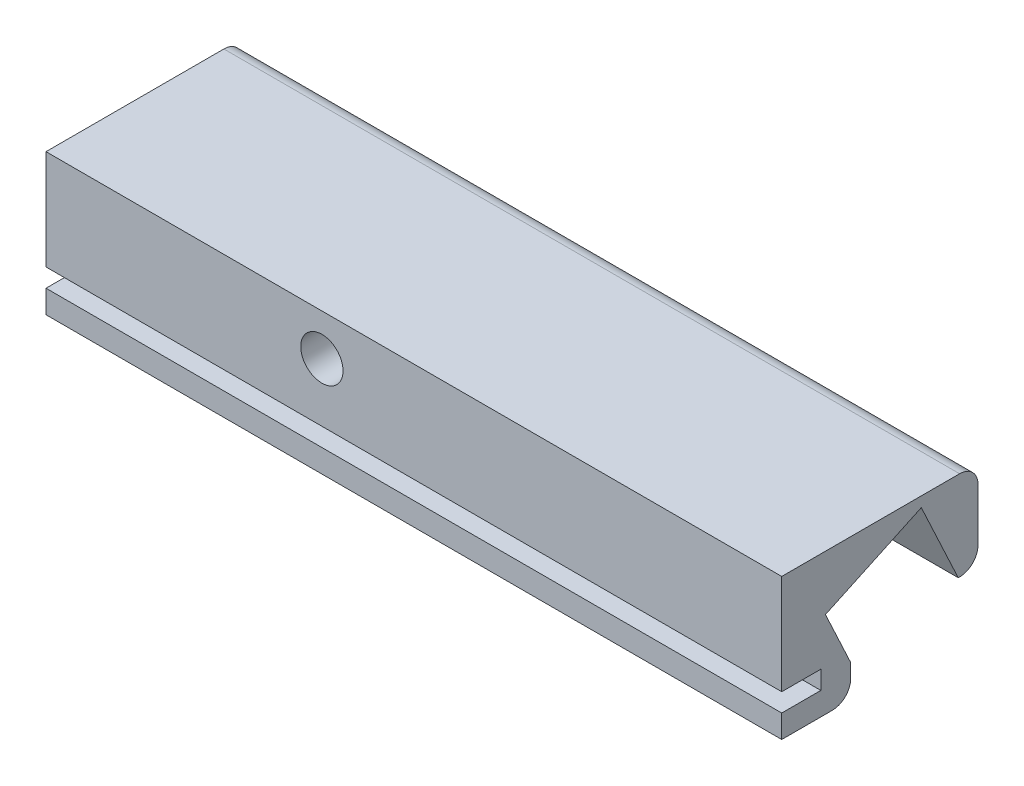
ISO-10303-21;
HEADER;
FILE_DESCRIPTION(('STEP AP214'),'2;1');
FILE_NAME('part.step','',(''),(''),'','','');
FILE_SCHEMA(('AUTOMOTIVE_DESIGN { 1 0 10303 214 1 1 1 1 }'));
ENDSEC;
DATA;
#1=APPLICATION_CONTEXT('core data for automotive mechanical design processes');
#2=APPLICATION_PROTOCOL_DEFINITION('international standard','automotive_design',2000,#1);
#3=PRODUCT_CONTEXT('',#1,'mechanical');
#4=PRODUCT('Part','Part','',(#3));
#5=PRODUCT_RELATED_PRODUCT_CATEGORY('part','',(#4));
#6=PRODUCT_DEFINITION_FORMATION('','',#4);
#7=PRODUCT_DEFINITION_CONTEXT('part definition',#1,'design');
#8=PRODUCT_DEFINITION('design','',#6,#7);
#9=PRODUCT_DEFINITION_SHAPE('','',#8);
#10=(LENGTH_UNIT() NAMED_UNIT(*) SI_UNIT(.MILLI.,.METRE.));
#11=(NAMED_UNIT(*) PLANE_ANGLE_UNIT() SI_UNIT($,.RADIAN.));
#12=(NAMED_UNIT(*) SI_UNIT($,.STERADIAN.) SOLID_ANGLE_UNIT());
#13=UNCERTAINTY_MEASURE_WITH_UNIT(LENGTH_MEASURE(1.E-05),#10,'distance_accuracy_value','');
#14=(GEOMETRIC_REPRESENTATION_CONTEXT(3) GLOBAL_UNCERTAINTY_ASSIGNED_CONTEXT((#13)) GLOBAL_UNIT_ASSIGNED_CONTEXT((#10,
#11,#12)) REPRESENTATION_CONTEXT('',''));
#15=CARTESIAN_POINT('',(0.,0.,0.));
#16=DIRECTION('',(0.,0.,1.));
#17=DIRECTION('',(1.,0.,0.));
#18=AXIS2_PLACEMENT_3D('',#15,#16,#17);
#19=CARTESIAN_POINT('',(80.,15.360110010018,0.));
#20=DIRECTION('',(0.,0.,-1.));
#21=DIRECTION('',(0.,1.,0.));
#22=AXIS2_PLACEMENT_3D('',#19,#20,#21);
#23=PLANE('',#22);
#24=CARTESIAN_POINT('',(30.,10.860110010018,0.));
#25=DIRECTION('',(0.,0.,1.));
#26=DIRECTION('',(1.,0.,0.));
#27=AXIS2_PLACEMENT_3D('',#24,#25,#26);
#28=CIRCLE('',#27,2.3);
#29=CARTESIAN_POINT('',(32.3,10.860110010018,0.));
#30=VERTEX_POINT('',#29);
#31=EDGE_CURVE('E189',#30,#30,#28,.T.);
#32=ORIENTED_EDGE('',*,*,#31,.F.);
#33=EDGE_LOOP('',(#32));
#34=FACE_BOUND('',#33,.T.);
#35=DIRECTION('',(0.,-1.,0.));
#36=VECTOR('',#35,1.);
#37=CARTESIAN_POINT('',(0.,15.360110010018,0.));
#38=LINE('',#37,#36);
#39=CARTESIAN_POINT('',(0.,15.360110010018,0.));
#40=VERTEX_POINT('',#39);
#41=CARTESIAN_POINT('',(0.,4.5,0.));
#42=VERTEX_POINT('',#41);
#43=EDGE_CURVE('E238',#40,#42,#38,.T.);
#44=ORIENTED_EDGE('',*,*,#43,.T.);
#45=DIRECTION('',(-1.,0.,0.));
#46=VECTOR('',#45,1.);
#47=CARTESIAN_POINT('',(0.,4.5,0.));
#48=LINE('',#47,#46);
#49=CARTESIAN_POINT('',(80.,4.5,0.));
#50=VERTEX_POINT('',#49);
#51=EDGE_CURVE('E173',#50,#42,#48,.T.);
#52=ORIENTED_EDGE('',*,*,#51,.F.);
#53=DIRECTION('',(0.,-1.,0.));
#54=VECTOR('',#53,1.);
#55=CARTESIAN_POINT('',(80.,15.360110010018,0.));
#56=LINE('',#55,#54);
#57=CARTESIAN_POINT('',(80.,15.360110010018,0.));
#58=VERTEX_POINT('',#57);
#59=EDGE_CURVE('E217',#58,#50,#56,.T.);
#60=ORIENTED_EDGE('',*,*,#59,.F.);
#61=DIRECTION('',(-1.,0.,0.));
#62=VECTOR('',#61,1.);
#63=CARTESIAN_POINT('',(80.,15.360110010018,0.));
#64=LINE('',#63,#62);
#65=EDGE_CURVE('E237',#58,#40,#64,.T.);
#66=ORIENTED_EDGE('',*,*,#65,.T.);
#67=EDGE_LOOP('',(#44,#52,#60,#66));
#68=FACE_BOUND('',#67,.T.);
#69=ADVANCED_FACE('F41',(#34,#68),#23,.F.);
#70=CARTESIAN_POINT('',(80.,2.5,0.));
#71=VERTEX_POINT('',#70);
#72=CARTESIAN_POINT('',(80.,0.,0.));
#73=VERTEX_POINT('',#72);
#74=EDGE_CURVE('E221',#71,#73,#56,.T.);
#75=ORIENTED_EDGE('',*,*,#74,.F.);
#76=DIRECTION('',(1.,0.,0.));
#77=VECTOR('',#76,1.);
#78=CARTESIAN_POINT('',(0.,2.5,0.));
#79=LINE('',#78,#77);
#80=CARTESIAN_POINT('',(0.,2.5,0.));
#81=VERTEX_POINT('',#80);
#82=EDGE_CURVE('E309',#81,#71,#79,.T.);
#83=ORIENTED_EDGE('',*,*,#82,.F.);
#84=CARTESIAN_POINT('',(0.,0.,0.));
#85=VERTEX_POINT('',#84);
#86=EDGE_CURVE('E178',#81,#85,#38,.T.);
#87=ORIENTED_EDGE('',*,*,#86,.T.);
#88=DIRECTION('',(-1.,0.,0.));
#89=VECTOR('',#88,1.);
#90=CARTESIAN_POINT('',(80.,0.,0.));
#91=LINE('',#90,#89);
#92=EDGE_CURVE('E11',#73,#85,#91,.T.);
#93=ORIENTED_EDGE('',*,*,#92,.F.);
#94=EDGE_LOOP('',(#75,#83,#87,#93));
#95=FACE_BOUND('',#94,.T.);
#96=ADVANCED_FACE('F43',(#95),#23,.F.);
#97=CARTESIAN_POINT('',(80.,0.,0.));
#98=DIRECTION('',(0.,1.,0.));
#99=DIRECTION('',(0.,0.,1.));
#100=AXIS2_PLACEMENT_3D('',#97,#98,#99);
#101=PLANE('',#100);
#102=DIRECTION('',(0.,0.,-1.));
#103=VECTOR('',#102,1.);
#104=CARTESIAN_POINT('',(0.,0.,0.));
#105=LINE('',#104,#103);
#106=CARTESIAN_POINT('',(0.,0.,-5.4994615533352));
#107=VERTEX_POINT('',#106);
#108=EDGE_CURVE('E241',#85,#107,#105,.T.);
#109=ORIENTED_EDGE('',*,*,#108,.T.);
#110=DIRECTION('',(-1.,0.,0.));
#111=VECTOR('',#110,1.);
#112=CARTESIAN_POINT('',(80.,0.,-5.4994615533352));
#113=LINE('',#112,#111);
#114=CARTESIAN_POINT('',(80.,0.,-5.4994615533352));
#115=VERTEX_POINT('',#114);
#116=EDGE_CURVE('E49',#115,#107,#113,.T.);
#117=ORIENTED_EDGE('',*,*,#116,.F.);
#118=DIRECTION('',(0.,0.,-1.));
#119=VECTOR('',#118,1.);
#120=CARTESIAN_POINT('',(80.,0.,0.));
#121=LINE('',#120,#119);
#122=EDGE_CURVE('E220',#73,#115,#121,.T.);
#123=ORIENTED_EDGE('',*,*,#122,.F.);
#124=ORIENTED_EDGE('',*,*,#92,.T.);
#125=EDGE_LOOP('',(#109,#117,#123,#124));
#126=FACE_BOUND('',#125,.T.);
#127=ADVANCED_FACE('F307',(#126),#101,.F.);
#128=CARTESIAN_POINT('',(80.,2.0005384466648,-5.4994615533352));
#129=DIRECTION('',(-1.,0.,0.));
#130=DIRECTION('',(0.,0.,1.));
#131=AXIS2_PLACEMENT_3D('',#128,#129,#130);
#132=CYLINDRICAL_SURFACE('',#131,2.0005384466648);
#133=CARTESIAN_POINT('',(0.,2.0005384466648,-5.4994615533352));
#134=DIRECTION('',(1.,0.,0.));
#135=DIRECTION('',(0.,0.,-1.));
#136=AXIS2_PLACEMENT_3D('',#133,#134,#135);
#137=CIRCLE('',#136,2.0005384466648);
#138=CARTESIAN_POINT('',(0.,2.0005384466648,-7.5));
#139=VERTEX_POINT('',#138);
#140=EDGE_CURVE('E243',#107,#139,#137,.T.);
#141=ORIENTED_EDGE('',*,*,#140,.T.);
#142=DIRECTION('',(-1.,0.,0.));
#143=VECTOR('',#142,1.);
#144=CARTESIAN_POINT('',(80.,2.0005384466648,-7.5));
#145=LINE('',#144,#143);
#146=CARTESIAN_POINT('',(80.,2.0005384466648,-7.5));
#147=VERTEX_POINT('',#146);
#148=EDGE_CURVE('E281',#147,#139,#145,.T.);
#149=ORIENTED_EDGE('',*,*,#148,.F.);
#150=CARTESIAN_POINT('',(80.,2.0005384466648,-5.4994615533352));
#151=DIRECTION('',(1.,0.,0.));
#152=DIRECTION('',(0.,0.,-1.));
#153=AXIS2_PLACEMENT_3D('',#150,#151,#152);
#154=CIRCLE('',#153,2.0005384466648);
#155=EDGE_CURVE('E223',#115,#147,#154,.T.);
#156=ORIENTED_EDGE('',*,*,#155,.F.);
#157=ORIENTED_EDGE('',*,*,#116,.T.);
#158=EDGE_LOOP('',(#141,#149,#156,#157));
#159=FACE_BOUND('',#158,.T.);
#160=ADVANCED_FACE('F288',(#159),#132,.T.);
#161=CARTESIAN_POINT('',(80.,3.5,-7.5));
#162=DIRECTION('',(0.,0.,1.));
#163=DIRECTION('',(0.,-1.,0.));
#164=AXIS2_PLACEMENT_3D('',#161,#162,#163);
#165=PLANE('',#164);
#166=DIRECTION('',(0.,1.,0.));
#167=VECTOR('',#166,1.);
#168=CARTESIAN_POINT('',(0.,3.5,-7.5));
#169=LINE('',#168,#167);
#170=CARTESIAN_POINT('',(0.,3.5,-7.5));
#171=VERTEX_POINT('',#170);
#172=EDGE_CURVE('E245',#139,#171,#169,.T.);
#173=ORIENTED_EDGE('',*,*,#172,.T.);
#174=DIRECTION('',(-1.,0.,0.));
#175=VECTOR('',#174,1.);
#176=CARTESIAN_POINT('',(80.,3.5,-7.5));
#177=LINE('',#176,#175);
#178=CARTESIAN_POINT('',(52.,3.5,-7.5));
#179=VERTEX_POINT('',#178);
#180=EDGE_CURVE('E277',#179,#171,#177,.T.);
#181=ORIENTED_EDGE('',*,*,#180,.F.);
#182=CARTESIAN_POINT('',(80.,3.5,-7.5));
#183=VERTEX_POINT('',#182);
#184=EDGE_CURVE('E278',#183,#179,#177,.T.);
#185=ORIENTED_EDGE('',*,*,#184,.F.);
#186=DIRECTION('',(0.,1.,0.));
#187=VECTOR('',#186,1.);
#188=CARTESIAN_POINT('',(80.,3.5,-7.5));
#189=LINE('',#188,#187);
#190=EDGE_CURVE('E225',#147,#183,#189,.T.);
#191=ORIENTED_EDGE('',*,*,#190,.F.);
#192=ORIENTED_EDGE('',*,*,#148,.T.);
#193=EDGE_LOOP('',(#173,#181,#185,#191,#192));
#194=FACE_BOUND('',#193,.T.);
#195=ADVANCED_FACE('F297',(#194),#165,.F.);
#196=CARTESIAN_POINT('',(80.,8.36011001001802,-17.9225395509215));
#197=DIRECTION('',(0.,0.906307787036651,0.422618261740697));
#198=DIRECTION('',(0.,-0.422618261740697,0.906307787036651));
#199=AXIS2_PLACEMENT_3D('',#196,#197,#198);
#200=PLANE('',#199);
#201=CARTESIAN_POINT('',(43.85,5.93005500500901,-12.7112697754607));
#202=DIRECTION('',(0.,-0.906307787036651,-0.422618261740697));
#203=DIRECTION('',(0.,0.422618261740697,-0.906307787036651));
#204=AXIS2_PLACEMENT_3D('',#201,#202,#203);
#205=CIRCLE('',#204,2.30000000000001);
#206=CARTESIAN_POINT('',(43.85,6.90207700701262,-14.7957776856451));
#207=VERTEX_POINT('',#206);
#208=EDGE_CURVE('E208',#207,#207,#205,.T.);
#209=ORIENTED_EDGE('',*,*,#208,.F.);
#210=EDGE_LOOP('',(#209));
#211=FACE_BOUND('',#210,.T.);
#212=DIRECTION('',(-1.,0.,0.));
#213=VECTOR('',#212,1.);
#214=CARTESIAN_POINT('',(80.,8.36011001001802,-17.9225395509215));
#215=LINE('',#214,#213);
#216=CARTESIAN_POINT('',(52.,8.36011001001802,-17.9225395509215));
#217=VERTEX_POINT('',#216);
#218=CARTESIAN_POINT('',(0.,8.36011001001802,-17.9225395509215));
#219=VERTEX_POINT('',#218);
#220=EDGE_CURVE('E275',#217,#219,#215,.T.);
#221=ORIENTED_EDGE('',*,*,#220,.F.);
#222=DIRECTION('',(0.,0.422618261740697,-0.906307787036651));
#223=VECTOR('',#222,1.);
#224=CARTESIAN_POINT('',(52.,3.5,-7.5));
#225=LINE('',#224,#223);
#226=EDGE_CURVE('E188',#179,#217,#225,.T.);
#227=ORIENTED_EDGE('',*,*,#226,.F.);
#228=ORIENTED_EDGE('',*,*,#180,.T.);
#229=DIRECTION('',(0.,0.422618261740697,-0.906307787036651));
#230=VECTOR('',#229,1.);
#231=CARTESIAN_POINT('',(0.,8.36011001001802,-17.9225395509215));
#232=LINE('',#231,#230);
#233=EDGE_CURVE('E248',#171,#219,#232,.T.);
#234=ORIENTED_EDGE('',*,*,#233,.T.);
#235=EDGE_LOOP('',(#221,#227,#228,#234));
#236=FACE_BOUND('',#235,.T.);
#237=ADVANCED_FACE('F344',(#211,#236),#200,.F.);
#238=CARTESIAN_POINT('',(80.,5.64118664890806,-19.1903943361436));
#239=DIRECTION('',(0.,0.422618261740697,-0.906307787036651));
#240=DIRECTION('',(0.,0.906307787036651,0.422618261740697));
#241=AXIS2_PLACEMENT_3D('',#238,#239,#240);
#242=PLANE('',#241);
#243=DIRECTION('',(0.,-0.906307787036651,-0.422618261740697));
#244=VECTOR('',#243,1.);
#245=CARTESIAN_POINT('',(0.,5.64118664890806,-19.1903943361436));
#246=LINE('',#245,#244);
#247=CARTESIAN_POINT('',(0.,5.64118664890806,-19.1903943361436));
#248=VERTEX_POINT('',#247);
#249=EDGE_CURVE('E251',#219,#248,#246,.T.);
#250=ORIENTED_EDGE('',*,*,#249,.T.);
#251=DIRECTION('',(-1.,0.,0.));
#252=VECTOR('',#251,1.);
#253=CARTESIAN_POINT('',(80.,5.64118664890806,-19.1903943361436));
#254=LINE('',#253,#252);
#255=CARTESIAN_POINT('',(80.,5.64118664890806,-19.1903943361436));
#256=VERTEX_POINT('',#255);
#257=EDGE_CURVE('E272',#256,#248,#254,.T.);
#258=ORIENTED_EDGE('',*,*,#257,.F.);
#259=DIRECTION('',(0.,-0.906307787036651,-0.422618261740697));
#260=VECTOR('',#259,1.);
#261=CARTESIAN_POINT('',(80.,5.64118664890806,-19.1903943361436));
#262=LINE('',#261,#260);
#263=CARTESIAN_POINT('',(80.,14.2511106257563,-15.175520849607));
#264=VERTEX_POINT('',#263);
#265=EDGE_CURVE('E64',#264,#256,#262,.T.);
#266=ORIENTED_EDGE('',*,*,#265,.F.);
#267=DIRECTION('',(1.,0.,0.));
#268=VECTOR('',#267,1.);
#269=CARTESIAN_POINT('',(52.,14.2511106257563,-15.175520849607));
#270=LINE('',#269,#268);
#271=CARTESIAN_POINT('',(52.,14.2511106257563,-15.175520849607));
#272=VERTEX_POINT('',#271);
#273=EDGE_CURVE('E196',#272,#264,#270,.T.);
#274=ORIENTED_EDGE('',*,*,#273,.F.);
#275=DIRECTION('',(0.,-0.906307787036651,-0.422618261740697));
#276=VECTOR('',#275,1.);
#277=CARTESIAN_POINT('',(52.,14.2511106257563,-15.175520849607));
#278=LINE('',#277,#276);
#279=EDGE_CURVE('E203',#272,#217,#278,.T.);
#280=ORIENTED_EDGE('',*,*,#279,.T.);
#281=ORIENTED_EDGE('',*,*,#220,.T.);
#282=EDGE_LOOP('',(#250,#258,#266,#274,#280,#281));
#283=FACE_BOUND('',#282,.T.);
#284=ADVANCED_FACE('F340',(#283),#242,.F.);
#285=CARTESIAN_POINT('',(80.,7.63552847711335,-19.3407295358501));
#286=DIRECTION('',(-1.,0.,0.));
#287=DIRECTION('',(0.,0.,1.));
#288=AXIS2_PLACEMENT_3D('',#285,#286,#287);
#289=CYLINDRICAL_SURFACE('',#288,2.);
#290=CARTESIAN_POINT('',(0.,7.63552847711335,-19.3407295358501));
#291=DIRECTION('',(1.,0.,0.));
#292=DIRECTION('',(0.,0.,-1.));
#293=AXIS2_PLACEMENT_3D('',#290,#291,#292);
#294=CIRCLE('',#293,2.);
#295=CARTESIAN_POINT('',(0.,7.63552847711335,-21.3407295358501));
#296=VERTEX_POINT('',#295);
#297=EDGE_CURVE('E253',#248,#296,#294,.T.);
#298=ORIENTED_EDGE('',*,*,#297,.T.);
#299=DIRECTION('',(-1.,0.,0.));
#300=VECTOR('',#299,1.);
#301=CARTESIAN_POINT('',(80.,7.63552847711335,-21.3407295358501));
#302=LINE('',#301,#300);
#303=CARTESIAN_POINT('',(80.,7.63552847711335,-21.3407295358501));
#304=VERTEX_POINT('',#303);
#305=EDGE_CURVE('E269',#304,#296,#302,.T.);
#306=ORIENTED_EDGE('',*,*,#305,.F.);
#307=CARTESIAN_POINT('',(80.,7.63552847711335,-19.3407295358501));
#308=DIRECTION('',(1.,0.,0.));
#309=DIRECTION('',(0.,0.,-1.));
#310=AXIS2_PLACEMENT_3D('',#307,#308,#309);
#311=CIRCLE('',#310,2.);
#312=EDGE_CURVE('E229',#256,#304,#311,.T.);
#313=ORIENTED_EDGE('',*,*,#312,.F.);
#314=ORIENTED_EDGE('',*,*,#257,.T.);
#315=EDGE_LOOP('',(#298,#306,#313,#314));
#316=FACE_BOUND('',#315,.T.);
#317=ADVANCED_FACE('F339',(#316),#289,.T.);
#318=CARTESIAN_POINT('',(80.,7.63552847711335,-21.3407295358501));
#319=DIRECTION('',(0.,0.,1.));
#320=DIRECTION('',(0.,-1.,0.));
#321=AXIS2_PLACEMENT_3D('',#318,#319,#320);
#322=PLANE('',#321);
#323=DIRECTION('',(0.,1.,0.));
#324=VECTOR('',#323,1.);
#325=CARTESIAN_POINT('',(0.,7.63552847711335,-21.3407295358501));
#326=LINE('',#325,#324);
#327=CARTESIAN_POINT('',(0.,13.360110010018,-21.3407295358501));
#328=VERTEX_POINT('',#327);
#329=EDGE_CURVE('E255',#296,#328,#326,.T.);
#330=ORIENTED_EDGE('',*,*,#329,.T.);
#331=DIRECTION('',(-1.,0.,0.));
#332=VECTOR('',#331,1.);
#333=CARTESIAN_POINT('',(80.,13.360110010018,-21.3407295358501));
#334=LINE('',#333,#332);
#335=CARTESIAN_POINT('',(80.,13.360110010018,-21.3407295358501));
#336=VERTEX_POINT('',#335);
#337=EDGE_CURVE('E266',#336,#328,#334,.T.);
#338=ORIENTED_EDGE('',*,*,#337,.F.);
#339=DIRECTION('',(0.,1.,0.));
#340=VECTOR('',#339,1.);
#341=CARTESIAN_POINT('',(80.,7.63552847711335,-21.3407295358501));
#342=LINE('',#341,#340);
#343=EDGE_CURVE('E231',#304,#336,#342,.T.);
#344=ORIENTED_EDGE('',*,*,#343,.F.);
#345=ORIENTED_EDGE('',*,*,#305,.T.);
#346=EDGE_LOOP('',(#330,#338,#344,#345));
#347=FACE_BOUND('',#346,.T.);
#348=ADVANCED_FACE('F335',(#347),#322,.F.);
#349=CARTESIAN_POINT('',(80.,13.360110010018,-19.3407295358501));
#350=DIRECTION('',(-1.,0.,0.));
#351=DIRECTION('',(0.,0.,1.));
#352=AXIS2_PLACEMENT_3D('',#349,#350,#351);
#353=CYLINDRICAL_SURFACE('',#352,2.);
#354=CARTESIAN_POINT('',(0.,13.360110010018,-19.3407295358501));
#355=DIRECTION('',(1.,0.,0.));
#356=DIRECTION('',(0.,0.,1.));
#357=AXIS2_PLACEMENT_3D('',#354,#355,#356);
#358=CIRCLE('',#357,2.);
#359=CARTESIAN_POINT('',(0.,15.360110010018,-19.3407295358501));
#360=VERTEX_POINT('',#359);
#361=EDGE_CURVE('E257',#328,#360,#358,.T.);
#362=ORIENTED_EDGE('',*,*,#361,.T.);
#363=DIRECTION('',(-1.,0.,0.));
#364=VECTOR('',#363,1.);
#365=CARTESIAN_POINT('',(80.,15.360110010018,-19.3407295358501));
#366=LINE('',#365,#364);
#367=CARTESIAN_POINT('',(80.,15.360110010018,-19.3407295358501));
#368=VERTEX_POINT('',#367);
#369=EDGE_CURVE('E263',#368,#360,#366,.T.);
#370=ORIENTED_EDGE('',*,*,#369,.F.);
#371=CARTESIAN_POINT('',(80.,13.360110010018,-19.3407295358501));
#372=DIRECTION('',(1.,0.,0.));
#373=DIRECTION('',(0.,0.,1.));
#374=AXIS2_PLACEMENT_3D('',#371,#372,#373);
#375=CIRCLE('',#374,2.);
#376=EDGE_CURVE('E233',#336,#368,#375,.T.);
#377=ORIENTED_EDGE('',*,*,#376,.F.);
#378=ORIENTED_EDGE('',*,*,#337,.T.);
#379=EDGE_LOOP('',(#362,#370,#377,#378));
#380=FACE_BOUND('',#379,.T.);
#381=ADVANCED_FACE('F331',(#380),#353,.T.);
#382=CARTESIAN_POINT('',(80.,15.360110010018,-19.3407295358501));
#383=DIRECTION('',(0.,-1.,0.));
#384=DIRECTION('',(0.,0.,-1.));
#385=AXIS2_PLACEMENT_3D('',#382,#383,#384);
#386=PLANE('',#385);
#387=DIRECTION('',(0.,0.,1.));
#388=VECTOR('',#387,1.);
#389=CARTESIAN_POINT('',(0.,15.360110010018,-19.3407295358501));
#390=LINE('',#389,#388);
#391=EDGE_CURVE('E259',#360,#40,#390,.T.);
#392=ORIENTED_EDGE('',*,*,#391,.T.);
#393=ORIENTED_EDGE('',*,*,#65,.F.);
#394=DIRECTION('',(0.,0.,1.));
#395=VECTOR('',#394,1.);
#396=CARTESIAN_POINT('',(80.,15.360110010018,-19.3407295358501));
#397=LINE('',#396,#395);
#398=EDGE_CURVE('E235',#368,#58,#397,.T.);
#399=ORIENTED_EDGE('',*,*,#398,.F.);
#400=ORIENTED_EDGE('',*,*,#369,.T.);
#401=EDGE_LOOP('',(#392,#393,#399,#400));
#402=FACE_BOUND('',#401,.T.);
#403=ADVANCED_FACE('F325',(#402),#386,.F.);
#404=CARTESIAN_POINT('',(80.,2.0005384466648,-5.4994615533352));
#405=DIRECTION('',(1.,0.,0.));
#406=DIRECTION('',(0.,0.,-1.));
#407=AXIS2_PLACEMENT_3D('',#404,#405,#406);
#408=PLANE('',#407);
#409=DIRECTION('',(0.,0.,1.));
#410=VECTOR('',#409,1.);
#411=CARTESIAN_POINT('',(80.,4.5,-4.25));
#412=LINE('',#411,#410);
#413=CARTESIAN_POINT('',(80.,4.5,-4.25));
#414=VERTEX_POINT('',#413);
#415=EDGE_CURVE('E180',#414,#50,#412,.T.);
#416=ORIENTED_EDGE('',*,*,#415,.F.);
#417=DIRECTION('',(0.,1.,0.));
#418=VECTOR('',#417,1.);
#419=CARTESIAN_POINT('',(80.,4.5,-4.25));
#420=LINE('',#419,#418);
#421=CARTESIAN_POINT('',(80.,2.5,-4.25));
#422=VERTEX_POINT('',#421);
#423=EDGE_CURVE('E166',#422,#414,#420,.T.);
#424=ORIENTED_EDGE('',*,*,#423,.F.);
#425=DIRECTION('',(0.,0.,1.));
#426=VECTOR('',#425,1.);
#427=CARTESIAN_POINT('',(80.,2.5,-4.25));
#428=LINE('',#427,#426);
#429=EDGE_CURVE('E164',#422,#71,#428,.T.);
#430=ORIENTED_EDGE('',*,*,#429,.T.);
#431=ORIENTED_EDGE('',*,*,#74,.T.);
#432=ORIENTED_EDGE('',*,*,#122,.T.);
#433=ORIENTED_EDGE('',*,*,#155,.T.);
#434=ORIENTED_EDGE('',*,*,#190,.T.);
#435=DIRECTION('',(0.,-0.906307787036651,-0.422618261740697));
#436=VECTOR('',#435,1.);
#437=CARTESIAN_POINT('',(80.,9.39100061573824,-4.75298129868547));
#438=LINE('',#437,#436);
#439=CARTESIAN_POINT('',(80.,9.39100061573824,-4.75298129868547));
#440=VERTEX_POINT('',#439);
#441=EDGE_CURVE('E209',#440,#183,#438,.T.);
#442=ORIENTED_EDGE('',*,*,#441,.F.);
#443=DIRECTION('',(0.,-0.422618261740697,0.906307787036651));
#444=VECTOR('',#443,1.);
#445=CARTESIAN_POINT('',(80.,9.39100061573824,-4.75298129868547));
#446=LINE('',#445,#444);
#447=EDGE_CURVE('E198',#264,#440,#446,.T.);
#448=ORIENTED_EDGE('',*,*,#447,.F.);
#449=ORIENTED_EDGE('',*,*,#265,.T.);
#450=ORIENTED_EDGE('',*,*,#312,.T.);
#451=ORIENTED_EDGE('',*,*,#343,.T.);
#452=ORIENTED_EDGE('',*,*,#376,.T.);
#453=ORIENTED_EDGE('',*,*,#398,.T.);
#454=ORIENTED_EDGE('',*,*,#59,.T.);
#455=EDGE_LOOP('',(#416,#424,#430,#431,#432,#433,#434,#442,#448,#449,#450,#451,#452,#453,#454));
#456=FACE_BOUND('',#455,.T.);
#457=ADVANCED_FACE('F303',(#456),#408,.T.);
#458=CARTESIAN_POINT('',(0.,2.0005384466648,-5.4994615533352));
#459=DIRECTION('',(1.,0.,0.));
#460=DIRECTION('',(0.,0.,-1.));
#461=AXIS2_PLACEMENT_3D('',#458,#459,#460);
#462=PLANE('',#461);
#463=DIRECTION('',(0.,-1.,0.));
#464=VECTOR('',#463,1.);
#465=CARTESIAN_POINT('',(0.,4.5,-4.25));
#466=LINE('',#465,#464);
#467=CARTESIAN_POINT('',(0.,4.5,-4.25));
#468=VERTEX_POINT('',#467);
#469=CARTESIAN_POINT('',(0.,2.5,-4.25));
#470=VERTEX_POINT('',#469);
#471=EDGE_CURVE('E167',#468,#470,#466,.T.);
#472=ORIENTED_EDGE('',*,*,#471,.F.);
#473=DIRECTION('',(0.,0.,1.));
#474=VECTOR('',#473,1.);
#475=CARTESIAN_POINT('',(0.,4.5,-4.25));
#476=LINE('',#475,#474);
#477=EDGE_CURVE('E192',#468,#42,#476,.T.);
#478=ORIENTED_EDGE('',*,*,#477,.T.);
#479=ORIENTED_EDGE('',*,*,#43,.F.);
#480=ORIENTED_EDGE('',*,*,#391,.F.);
#481=ORIENTED_EDGE('',*,*,#361,.F.);
#482=ORIENTED_EDGE('',*,*,#329,.F.);
#483=ORIENTED_EDGE('',*,*,#297,.F.);
#484=ORIENTED_EDGE('',*,*,#249,.F.);
#485=ORIENTED_EDGE('',*,*,#233,.F.);
#486=ORIENTED_EDGE('',*,*,#172,.F.);
#487=ORIENTED_EDGE('',*,*,#140,.F.);
#488=ORIENTED_EDGE('',*,*,#108,.F.);
#489=ORIENTED_EDGE('',*,*,#86,.F.);
#490=DIRECTION('',(0.,0.,1.));
#491=VECTOR('',#490,1.);
#492=CARTESIAN_POINT('',(0.,2.5,-4.25));
#493=LINE('',#492,#491);
#494=EDGE_CURVE('E161',#470,#81,#493,.T.);
#495=ORIENTED_EDGE('',*,*,#494,.F.);
#496=EDGE_LOOP('',(#472,#478,#479,#480,#481,#482,#483,#484,#485,#486,#487,#488,#489,#495));
#497=FACE_BOUND('',#496,.T.);
#498=ADVANCED_FACE('F176',(#497),#462,.F.);
#499=CARTESIAN_POINT('',(43.85,10.0084400466739,-10.8094875976276));
#500=DIRECTION('',(0.,-0.906307787036651,-0.422618261740697));
#501=DIRECTION('',(0.,0.422618261740697,-0.906307787036651));
#502=AXIS2_PLACEMENT_3D('',#499,#500,#501);
#503=CYLINDRICAL_SURFACE('',#502,2.30000000000001);
#504=CARTESIAN_POINT('',(43.85,10.0084400466739,-10.8094875976276));
#505=DIRECTION('',(0.,-0.906307787036651,-0.422618261740697));
#506=DIRECTION('',(0.,0.422618261740697,-0.906307787036651));
#507=AXIS2_PLACEMENT_3D('',#504,#505,#506);
#508=CIRCLE('',#507,2.30000000000001);
#509=CARTESIAN_POINT('',(43.85,10.9804620486776,-12.8939955078119));
#510=VERTEX_POINT('',#509);
#511=EDGE_CURVE('E212',#510,#510,#508,.T.);
#512=ORIENTED_EDGE('',*,*,#511,.F.);
#513=EDGE_LOOP('',(#512));
#514=FACE_BOUND('',#513,.T.);
#515=ORIENTED_EDGE('',*,*,#208,.T.);
#516=EDGE_LOOP('',(#515));
#517=FACE_BOUND('',#516,.T.);
#518=ADVANCED_FACE('F398',(#514,#517),#503,.F.);
#519=CARTESIAN_POINT('',(43.85,10.0084400466739,-10.8094875976276));
#520=DIRECTION('',(0.,-0.906307787036651,-0.422618261740697));
#521=DIRECTION('',(0.,0.422618261740697,-0.906307787036651));
#522=AXIS2_PLACEMENT_3D('',#519,#520,#521);
#523=PLANE('',#522);
#524=ORIENTED_EDGE('',*,*,#511,.T.);
#525=EDGE_LOOP('',(#524));
#526=FACE_BOUND('',#525,.T.);
#527=ADVANCED_FACE('F402',(#526),#523,.T.);
#528=CARTESIAN_POINT('',(52.,9.39100061573824,-4.75298129868547));
#529=DIRECTION('',(-1.,0.,0.));
#530=DIRECTION('',(0.,0.,1.));
#531=AXIS2_PLACEMENT_3D('',#528,#529,#530);
#532=PLANE('',#531);
#533=ORIENTED_EDGE('',*,*,#226,.T.);
#534=ORIENTED_EDGE('',*,*,#279,.F.);
#535=DIRECTION('',(0.,0.422618261740697,-0.906307787036651));
#536=VECTOR('',#535,1.);
#537=CARTESIAN_POINT('',(52.,9.39100061573824,-4.75298129868547));
#538=LINE('',#537,#536);
#539=CARTESIAN_POINT('',(52.,9.39100061573824,-4.75298129868547));
#540=VERTEX_POINT('',#539);
#541=EDGE_CURVE('E193',#540,#272,#538,.T.);
#542=ORIENTED_EDGE('',*,*,#541,.F.);
#543=DIRECTION('',(0.,-0.906307787036651,-0.422618261740697));
#544=VECTOR('',#543,1.);
#545=CARTESIAN_POINT('',(52.,9.39100061573824,-4.75298129868547));
#546=LINE('',#545,#544);
#547=EDGE_CURVE('E206',#540,#179,#546,.T.);
#548=ORIENTED_EDGE('',*,*,#547,.T.);
#549=EDGE_LOOP('',(#533,#534,#542,#548));
#550=FACE_BOUND('',#549,.T.);
#551=ADVANCED_FACE('F346',(#550),#532,.F.);
#552=CARTESIAN_POINT('',(52.,9.39100061573824,-4.75298129868547));
#553=DIRECTION('',(0.,-0.422618261740697,0.906307787036651));
#554=DIRECTION('',(0.,-0.906307787036651,-0.422618261740697));
#555=AXIS2_PLACEMENT_3D('',#552,#553,#554);
#556=PLANE('',#555);
#557=ORIENTED_EDGE('',*,*,#184,.T.);
#558=ORIENTED_EDGE('',*,*,#547,.F.);
#559=DIRECTION('',(-1.,0.,0.));
#560=VECTOR('',#559,1.);
#561=CARTESIAN_POINT('',(52.,9.39100061573824,-4.75298129868547));
#562=LINE('',#561,#560);
#563=EDGE_CURVE('E200',#440,#540,#562,.T.);
#564=ORIENTED_EDGE('',*,*,#563,.F.);
#565=ORIENTED_EDGE('',*,*,#441,.T.);
#566=EDGE_LOOP('',(#557,#558,#564,#565));
#567=FACE_BOUND('',#566,.T.);
#568=ADVANCED_FACE('F350',(#567),#556,.F.);
#569=CARTESIAN_POINT('',(0.,5.89321227099353,2.74805001309728));
#570=DIRECTION('',(0.,-0.906307787036651,-0.422618261740697));
#571=DIRECTION('',(0.,0.422618261740697,-0.906307787036651));
#572=AXIS2_PLACEMENT_3D('',#569,#570,#571);
#573=PLANE('',#572);
#574=ORIENTED_EDGE('',*,*,#541,.T.);
#575=ORIENTED_EDGE('',*,*,#273,.T.);
#576=ORIENTED_EDGE('',*,*,#447,.T.);
#577=ORIENTED_EDGE('',*,*,#563,.T.);
#578=EDGE_LOOP('',(#574,#575,#576,#577));
#579=FACE_BOUND('',#578,.T.);
#580=ADVANCED_FACE('F352',(#579),#573,.T.);
#581=CARTESIAN_POINT('',(30.,10.860110010018,-4.5));
#582=DIRECTION('',(0.,0.,1.));
#583=DIRECTION('',(1.,0.,0.));
#584=AXIS2_PLACEMENT_3D('',#581,#582,#583);
#585=CYLINDRICAL_SURFACE('',#584,2.3);
#586=CARTESIAN_POINT('',(30.,10.860110010018,-4.5));
#587=DIRECTION('',(0.,0.,1.));
#588=DIRECTION('',(1.,0.,0.));
#589=AXIS2_PLACEMENT_3D('',#586,#587,#588);
#590=CIRCLE('',#589,2.3);
#591=CARTESIAN_POINT('',(32.3,10.860110010018,-4.5));
#592=VERTEX_POINT('',#591);
#593=EDGE_CURVE('E185',#592,#592,#590,.T.);
#594=ORIENTED_EDGE('',*,*,#593,.F.);
#595=EDGE_LOOP('',(#594));
#596=FACE_BOUND('',#595,.T.);
#597=ORIENTED_EDGE('',*,*,#31,.T.);
#598=EDGE_LOOP('',(#597));
#599=FACE_BOUND('',#598,.T.);
#600=ADVANCED_FACE('F354',(#596,#599),#585,.F.);
#601=CARTESIAN_POINT('',(30.,10.860110010018,-4.5));
#602=DIRECTION('',(0.,0.,1.));
#603=DIRECTION('',(1.,0.,0.));
#604=AXIS2_PLACEMENT_3D('',#601,#602,#603);
#605=PLANE('',#604);
#606=ORIENTED_EDGE('',*,*,#593,.T.);
#607=EDGE_LOOP('',(#606));
#608=FACE_BOUND('',#607,.T.);
#609=ADVANCED_FACE('F360',(#608),#605,.T.);
#610=CARTESIAN_POINT('',(0.,4.5,-4.25));
#611=DIRECTION('',(0.,1.,0.));
#612=DIRECTION('',(0.,0.,1.));
#613=AXIS2_PLACEMENT_3D('',#610,#611,#612);
#614=PLANE('',#613);
#615=ORIENTED_EDGE('',*,*,#51,.T.);
#616=ORIENTED_EDGE('',*,*,#477,.F.);
#617=DIRECTION('',(-1.,0.,0.));
#618=VECTOR('',#617,1.);
#619=CARTESIAN_POINT('',(0.,4.5,-4.25));
#620=LINE('',#619,#618);
#621=EDGE_CURVE('E56',#414,#468,#620,.T.);
#622=ORIENTED_EDGE('',*,*,#621,.F.);
#623=ORIENTED_EDGE('',*,*,#415,.T.);
#624=EDGE_LOOP('',(#615,#616,#622,#623));
#625=FACE_BOUND('',#624,.T.);
#626=ADVANCED_FACE('F316',(#625),#614,.F.);
#627=CARTESIAN_POINT('',(0.,2.5,-4.25));
#628=DIRECTION('',(0.,-1.,0.));
#629=DIRECTION('',(1.,0.,0.));
#630=AXIS2_PLACEMENT_3D('',#627,#628,#629);
#631=PLANE('',#630);
#632=ORIENTED_EDGE('',*,*,#82,.T.);
#633=ORIENTED_EDGE('',*,*,#429,.F.);
#634=DIRECTION('',(1.,0.,0.));
#635=VECTOR('',#634,1.);
#636=CARTESIAN_POINT('',(0.,2.5,-4.25));
#637=LINE('',#636,#635);
#638=EDGE_CURVE('E158',#470,#422,#637,.T.);
#639=ORIENTED_EDGE('',*,*,#638,.F.);
#640=ORIENTED_EDGE('',*,*,#494,.T.);
#641=EDGE_LOOP('',(#632,#633,#639,#640));
#642=FACE_BOUND('',#641,.T.);
#643=ADVANCED_FACE('F159',(#642),#631,.F.);
#644=CARTESIAN_POINT('',(0.,0.,-4.25));
#645=DIRECTION('',(0.,0.,1.));
#646=DIRECTION('',(1.,0.,0.));
#647=AXIS2_PLACEMENT_3D('',#644,#645,#646);
#648=PLANE('',#647);
#649=ORIENTED_EDGE('',*,*,#471,.T.);
#650=ORIENTED_EDGE('',*,*,#638,.T.);
#651=ORIENTED_EDGE('',*,*,#423,.T.);
#652=ORIENTED_EDGE('',*,*,#621,.T.);
#653=EDGE_LOOP('',(#649,#650,#651,#652));
#654=FACE_BOUND('',#653,.T.);
#655=ADVANCED_FACE('F170',(#654),#648,.T.);
#656=CLOSED_SHELL('',(#69,#96,#127,#160,#195,#237,#284,#317,#348,#381,#403,#457,#498,#518,#527,
#551,#568,#580,#600,#609,#626,#643,#655));
#657=MANIFOLD_SOLID_BREP('B2',#656);
#658=ADVANCED_BREP_SHAPE_REPRESENTATION('',(#18,#657),#14);
#659=SHAPE_DEFINITION_REPRESENTATION(#9,#658);
ENDSEC;
END-ISO-10303-21;
